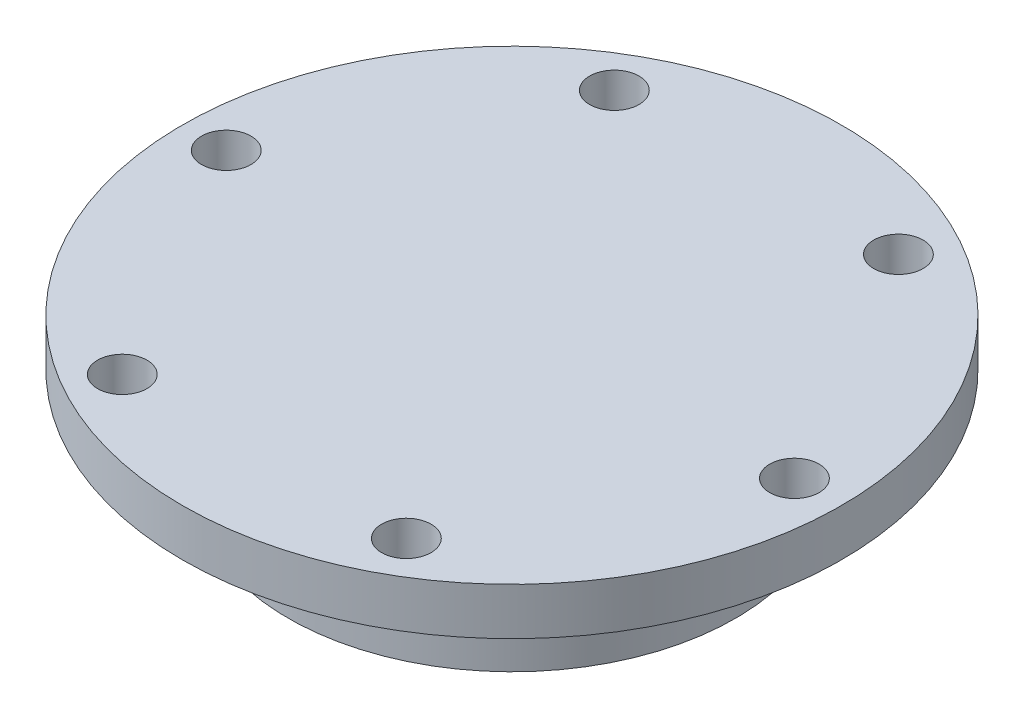
ISO-10303-21;
HEADER;
FILE_DESCRIPTION(('STEP AP214'),'2;1');
FILE_NAME('part.step','',(''),(''),'','','');
FILE_SCHEMA(('AUTOMOTIVE_DESIGN { 1 0 10303 214 1 1 1 1 }'));
ENDSEC;
DATA;
#1=APPLICATION_CONTEXT('core data for automotive mechanical design processes');
#2=APPLICATION_PROTOCOL_DEFINITION('international standard','automotive_design',2000,#1);
#3=PRODUCT_CONTEXT('',#1,'mechanical');
#4=PRODUCT('Part','Part','',(#3));
#5=PRODUCT_RELATED_PRODUCT_CATEGORY('part','',(#4));
#6=PRODUCT_DEFINITION_FORMATION('','',#4);
#7=PRODUCT_DEFINITION_CONTEXT('part definition',#1,'design');
#8=PRODUCT_DEFINITION('design','',#6,#7);
#9=PRODUCT_DEFINITION_SHAPE('','',#8);
#10=(LENGTH_UNIT() NAMED_UNIT(*) SI_UNIT(.MILLI.,.METRE.));
#11=(NAMED_UNIT(*) PLANE_ANGLE_UNIT() SI_UNIT($,.RADIAN.));
#12=(NAMED_UNIT(*) SI_UNIT($,.STERADIAN.) SOLID_ANGLE_UNIT());
#13=UNCERTAINTY_MEASURE_WITH_UNIT(LENGTH_MEASURE(1.E-05),#10,'distance_accuracy_value','');
#14=(GEOMETRIC_REPRESENTATION_CONTEXT(3) GLOBAL_UNCERTAINTY_ASSIGNED_CONTEXT((#13)) GLOBAL_UNIT_ASSIGNED_CONTEXT((#10,
#11,#12)) REPRESENTATION_CONTEXT('',''));
#15=CARTESIAN_POINT('',(0.,0.,0.));
#16=DIRECTION('',(0.,0.,1.));
#17=DIRECTION('',(1.,0.,0.));
#18=AXIS2_PLACEMENT_3D('',#15,#16,#17);
#19=CARTESIAN_POINT('',(0.,10.,0.));
#20=DIRECTION('',(0.,-1.,0.));
#21=DIRECTION('',(0.,0.,-1.));
#22=AXIS2_PLACEMENT_3D('',#19,#20,#21);
#23=CYLINDRICAL_SURFACE('',#22,70.);
#24=CARTESIAN_POINT('',(0.,10.,0.));
#25=DIRECTION('',(0.,1.,0.));
#26=DIRECTION('',(0.,0.,1.));
#27=AXIS2_PLACEMENT_3D('',#24,#25,#26);
#28=CIRCLE('',#27,70.);
#29=CARTESIAN_POINT('',(0.,10.,70.));
#30=VERTEX_POINT('',#29);
#31=EDGE_CURVE('E50',#30,#30,#28,.T.);
#32=ORIENTED_EDGE('',*,*,#31,.F.);
#33=EDGE_LOOP('',(#32));
#34=FACE_BOUND('',#33,.T.);
#35=CARTESIAN_POINT('',(0.,0.,0.));
#36=DIRECTION('',(0.,1.,0.));
#37=DIRECTION('',(0.,0.,1.));
#38=AXIS2_PLACEMENT_3D('',#35,#36,#37);
#39=CIRCLE('',#38,70.);
#40=CARTESIAN_POINT('',(0.,0.,70.));
#41=VERTEX_POINT('',#40);
#42=EDGE_CURVE('E55',#41,#41,#39,.T.);
#43=ORIENTED_EDGE('',*,*,#42,.T.);
#44=EDGE_LOOP('',(#43));
#45=FACE_BOUND('',#44,.T.);
#46=ADVANCED_FACE('F43',(#34,#45),#23,.T.);
#47=CARTESIAN_POINT('',(0.,10.,0.));
#48=DIRECTION('',(0.,1.,0.));
#49=DIRECTION('',(0.,0.,1.));
#50=AXIS2_PLACEMENT_3D('',#47,#48,#49);
#51=PLANE('',#50);
#52=CARTESIAN_POINT('',(29.8302954116914,10.,52.2554611962951));
#53=DIRECTION('',(0.,1.,0.));
#54=DIRECTION('',(0.,0.,1.));
#55=AXIS2_PLACEMENT_3D('',#52,#53,#54);
#56=CIRCLE('',#55,5.25);
#57=CARTESIAN_POINT('',(29.8302954116914,10.,57.5054611962951));
#58=VERTEX_POINT('',#57);
#59=EDGE_CURVE('E117',#58,#58,#56,.T.);
#60=ORIENTED_EDGE('',*,*,#59,.F.);
#61=EDGE_LOOP('',(#60));
#62=FACE_BOUND('',#61,.T.);
#63=CARTESIAN_POINT('',(-30.5091137649272,10.,52.2554611962958));
#64=DIRECTION('',(0.,1.,0.));
#65=DIRECTION('',(0.,0.,1.));
#66=AXIS2_PLACEMENT_3D('',#63,#64,#65);
#67=CIRCLE('',#66,5.24999999999999);
#68=CARTESIAN_POINT('',(-30.5091137649272,10.,57.5054611962958));
#69=VERTEX_POINT('',#68);
#70=EDGE_CURVE('E121',#69,#69,#67,.T.);
#71=ORIENTED_EDGE('',*,*,#70,.F.);
#72=EDGE_LOOP('',(#71));
#73=FACE_BOUND('',#72,.T.);
#74=CARTESIAN_POINT('',(-60.6788183532369,10.,0.));
#75=DIRECTION('',(0.,1.,0.));
#76=DIRECTION('',(0.,0.,1.));
#77=AXIS2_PLACEMENT_3D('',#74,#75,#76);
#78=CIRCLE('',#77,5.25);
#79=CARTESIAN_POINT('',(-60.6788183532369,10.,5.25000000000003));
#80=VERTEX_POINT('',#79);
#81=EDGE_CURVE('E125',#80,#80,#78,.T.);
#82=ORIENTED_EDGE('',*,*,#81,.F.);
#83=EDGE_LOOP('',(#82));
#84=FACE_BOUND('',#83,.T.);
#85=CARTESIAN_POINT('',(-30.509113764928,10.,-52.2554611962953));
#86=DIRECTION('',(0.,1.,0.));
#87=DIRECTION('',(0.,0.,1.));
#88=AXIS2_PLACEMENT_3D('',#85,#86,#87);
#89=CIRCLE('',#88,5.24999999999999);
#90=CARTESIAN_POINT('',(-30.509113764928,10.,-47.0054611962953));
#91=VERTEX_POINT('',#90);
#92=EDGE_CURVE('E77',#91,#91,#89,.T.);
#93=ORIENTED_EDGE('',*,*,#92,.F.);
#94=EDGE_LOOP('',(#93));
#95=FACE_BOUND('',#94,.T.);
#96=CARTESIAN_POINT('',(29.8302954116906,10.,-52.2554611962955));
#97=DIRECTION('',(0.,1.,0.));
#98=DIRECTION('',(0.,0.,1.));
#99=AXIS2_PLACEMENT_3D('',#96,#97,#98);
#100=CIRCLE('',#99,5.25);
#101=CARTESIAN_POINT('',(29.8302954116906,10.,-47.0054611962955));
#102=VERTEX_POINT('',#101);
#103=EDGE_CURVE('E65',#102,#102,#100,.T.);
#104=ORIENTED_EDGE('',*,*,#103,.F.);
#105=EDGE_LOOP('',(#104));
#106=FACE_BOUND('',#105,.T.);
#107=CARTESIAN_POINT('',(60.,10.,0.));
#108=DIRECTION('',(0.,1.,0.));
#109=DIRECTION('',(0.,0.,1.));
#110=AXIS2_PLACEMENT_3D('',#107,#108,#109);
#111=CIRCLE('',#110,5.24999999999999);
#112=CARTESIAN_POINT('',(60.,10.,5.24999999999999));
#113=VERTEX_POINT('',#112);
#114=EDGE_CURVE('E64',#113,#113,#111,.T.);
#115=ORIENTED_EDGE('',*,*,#114,.F.);
#116=EDGE_LOOP('',(#115));
#117=FACE_BOUND('',#116,.T.);
#118=ORIENTED_EDGE('',*,*,#31,.T.);
#119=EDGE_LOOP('',(#118));
#120=FACE_BOUND('',#119,.T.);
#121=ADVANCED_FACE('F98',(#62,#73,#84,#95,#106,#117,#120),#51,.T.);
#122=CARTESIAN_POINT('',(0.,0.,0.));
#123=DIRECTION('',(0.,1.,0.));
#124=DIRECTION('',(0.,0.,1.));
#125=AXIS2_PLACEMENT_3D('',#122,#123,#124);
#126=PLANE('',#125);
#127=CARTESIAN_POINT('',(29.8302954116914,0.,52.2554611962951));
#128=DIRECTION('',(0.,1.,0.));
#129=DIRECTION('',(0.,0.,1.));
#130=AXIS2_PLACEMENT_3D('',#127,#128,#129);
#131=CIRCLE('',#130,5.24999999999999);
#132=CARTESIAN_POINT('',(29.8302954116914,0.,57.5054611962951));
#133=VERTEX_POINT('',#132);
#134=EDGE_CURVE('E46',#133,#133,#131,.T.);
#135=ORIENTED_EDGE('',*,*,#134,.T.);
#136=EDGE_LOOP('',(#135));
#137=FACE_BOUND('',#136,.T.);
#138=CARTESIAN_POINT('',(-30.5091137649272,0.,52.2554611962958));
#139=DIRECTION('',(0.,1.,0.));
#140=DIRECTION('',(0.,0.,1.));
#141=AXIS2_PLACEMENT_3D('',#138,#139,#140);
#142=CIRCLE('',#141,5.24999999999999);
#143=CARTESIAN_POINT('',(-30.5091137649272,0.,57.5054611962958));
#144=VERTEX_POINT('',#143);
#145=EDGE_CURVE('E161',#144,#144,#142,.T.);
#146=ORIENTED_EDGE('',*,*,#145,.T.);
#147=EDGE_LOOP('',(#146));
#148=FACE_BOUND('',#147,.T.);
#149=CARTESIAN_POINT('',(-60.6788183532369,0.,0.));
#150=DIRECTION('',(0.,1.,0.));
#151=DIRECTION('',(0.,0.,1.));
#152=AXIS2_PLACEMENT_3D('',#149,#150,#151);
#153=CIRCLE('',#152,5.24999999999999);
#154=CARTESIAN_POINT('',(-60.6788183532369,0.,5.25000000000002));
#155=VERTEX_POINT('',#154);
#156=EDGE_CURVE('E168',#155,#155,#153,.T.);
#157=ORIENTED_EDGE('',*,*,#156,.T.);
#158=EDGE_LOOP('',(#157));
#159=FACE_BOUND('',#158,.T.);
#160=CARTESIAN_POINT('',(-30.509113764928,0.,-52.2554611962953));
#161=DIRECTION('',(0.,1.,0.));
#162=DIRECTION('',(0.,0.,1.));
#163=AXIS2_PLACEMENT_3D('',#160,#161,#162);
#164=CIRCLE('',#163,5.24999999999999);
#165=CARTESIAN_POINT('',(-30.509113764928,0.,-47.0054611962953));
#166=VERTEX_POINT('',#165);
#167=EDGE_CURVE('E72',#166,#166,#164,.T.);
#168=ORIENTED_EDGE('',*,*,#167,.T.);
#169=EDGE_LOOP('',(#168));
#170=FACE_BOUND('',#169,.T.);
#171=CARTESIAN_POINT('',(29.8302954116906,0.,-52.2554611962955));
#172=DIRECTION('',(0.,1.,0.));
#173=DIRECTION('',(0.,0.,1.));
#174=AXIS2_PLACEMENT_3D('',#171,#172,#173);
#175=CIRCLE('',#174,5.24999999999999);
#176=CARTESIAN_POINT('',(29.8302954116906,0.,-47.0054611962955));
#177=VERTEX_POINT('',#176);
#178=EDGE_CURVE('E62',#177,#177,#175,.T.);
#179=ORIENTED_EDGE('',*,*,#178,.T.);
#180=EDGE_LOOP('',(#179));
#181=FACE_BOUND('',#180,.T.);
#182=CARTESIAN_POINT('',(60.,0.,0.));
#183=DIRECTION('',(0.,1.,0.));
#184=DIRECTION('',(0.,0.,1.));
#185=AXIS2_PLACEMENT_3D('',#182,#183,#184);
#186=CIRCLE('',#185,5.24999999999999);
#187=CARTESIAN_POINT('',(60.,0.,5.24999999999999));
#188=VERTEX_POINT('',#187);
#189=EDGE_CURVE('E69',#188,#188,#186,.T.);
#190=ORIENTED_EDGE('',*,*,#189,.T.);
#191=EDGE_LOOP('',(#190));
#192=FACE_BOUND('',#191,.T.);
#193=CARTESIAN_POINT('',(0.,0.,0.));
#194=DIRECTION('',(0.,-1.,0.));
#195=DIRECTION('',(0.,0.,-1.));
#196=AXIS2_PLACEMENT_3D('',#193,#194,#195);
#197=CIRCLE('',#196,47.5);
#198=CARTESIAN_POINT('',(0.,0.,-47.5));
#199=VERTEX_POINT('',#198);
#200=EDGE_CURVE('E12',#199,#199,#197,.T.);
#201=ORIENTED_EDGE('',*,*,#200,.F.);
#202=EDGE_LOOP('',(#201));
#203=FACE_BOUND('',#202,.T.);
#204=ORIENTED_EDGE('',*,*,#42,.F.);
#205=EDGE_LOOP('',(#204));
#206=FACE_BOUND('',#205,.T.);
#207=ADVANCED_FACE('F90',(#137,#148,#159,#170,#181,#192,#203,#206),#126,.F.);
#208=CARTESIAN_POINT('',(0.,-22.,0.));
#209=DIRECTION('',(0.,1.,0.));
#210=DIRECTION('',(0.,0.,1.));
#211=AXIS2_PLACEMENT_3D('',#208,#209,#210);
#212=CYLINDRICAL_SURFACE('',#211,47.5);
#213=CARTESIAN_POINT('',(0.,-22.,0.));
#214=DIRECTION('',(0.,-1.,0.));
#215=DIRECTION('',(0.,0.,-1.));
#216=AXIS2_PLACEMENT_3D('',#213,#214,#215);
#217=CIRCLE('',#216,47.5);
#218=CARTESIAN_POINT('',(0.,-22.,-47.5));
#219=VERTEX_POINT('',#218);
#220=EDGE_CURVE('E58',#219,#219,#217,.T.);
#221=ORIENTED_EDGE('',*,*,#220,.F.);
#222=EDGE_LOOP('',(#221));
#223=FACE_BOUND('',#222,.T.);
#224=ORIENTED_EDGE('',*,*,#200,.T.);
#225=EDGE_LOOP('',(#224));
#226=FACE_BOUND('',#225,.T.);
#227=ADVANCED_FACE('F88',(#223,#226),#212,.T.);
#228=CARTESIAN_POINT('',(0.,-22.,0.));
#229=DIRECTION('',(0.,-1.,0.));
#230=DIRECTION('',(0.,0.,-1.));
#231=AXIS2_PLACEMENT_3D('',#228,#229,#230);
#232=PLANE('',#231);
#233=ORIENTED_EDGE('',*,*,#220,.T.);
#234=EDGE_LOOP('',(#233));
#235=FACE_BOUND('',#234,.T.);
#236=ADVANCED_FACE('F86',(#235),#232,.T.);
#237=CARTESIAN_POINT('',(60.,10.,0.));
#238=DIRECTION('',(0.,1.,0.));
#239=DIRECTION('',(0.,0.,1.));
#240=AXIS2_PLACEMENT_3D('',#237,#238,#239);
#241=CYLINDRICAL_SURFACE('',#240,5.24999999999999);
#242=ORIENTED_EDGE('',*,*,#114,.T.);
#243=EDGE_LOOP('',(#242));
#244=FACE_BOUND('',#243,.T.);
#245=ORIENTED_EDGE('',*,*,#189,.F.);
#246=EDGE_LOOP('',(#245));
#247=FACE_BOUND('',#246,.T.);
#248=ADVANCED_FACE('F96',(#244,#247),#241,.F.);
#249=CARTESIAN_POINT('',(29.8302954116906,10.,-52.2554611962955));
#250=DIRECTION('',(0.,1.,0.));
#251=DIRECTION('',(0.,0.,1.));
#252=AXIS2_PLACEMENT_3D('',#249,#250,#251);
#253=CYLINDRICAL_SURFACE('',#252,5.24999999999999);
#254=ORIENTED_EDGE('',*,*,#103,.T.);
#255=EDGE_LOOP('',(#254));
#256=FACE_BOUND('',#255,.T.);
#257=ORIENTED_EDGE('',*,*,#178,.F.);
#258=EDGE_LOOP('',(#257));
#259=FACE_BOUND('',#258,.T.);
#260=ADVANCED_FACE('F134',(#256,#259),#253,.F.);
#261=CARTESIAN_POINT('',(-30.509113764928,10.,-52.2554611962953));
#262=DIRECTION('',(0.,1.,0.));
#263=DIRECTION('',(0.,0.,1.));
#264=AXIS2_PLACEMENT_3D('',#261,#262,#263);
#265=CYLINDRICAL_SURFACE('',#264,5.24999999999999);
#266=ORIENTED_EDGE('',*,*,#92,.T.);
#267=EDGE_LOOP('',(#266));
#268=FACE_BOUND('',#267,.T.);
#269=ORIENTED_EDGE('',*,*,#167,.F.);
#270=EDGE_LOOP('',(#269));
#271=FACE_BOUND('',#270,.T.);
#272=ADVANCED_FACE('F139',(#268,#271),#265,.F.);
#273=CARTESIAN_POINT('',(-60.6788183532369,10.,0.));
#274=DIRECTION('',(0.,1.,0.));
#275=DIRECTION('',(0.,0.,1.));
#276=AXIS2_PLACEMENT_3D('',#273,#274,#275);
#277=CYLINDRICAL_SURFACE('',#276,5.24999999999999);
#278=ORIENTED_EDGE('',*,*,#81,.T.);
#279=EDGE_LOOP('',(#278));
#280=FACE_BOUND('',#279,.T.);
#281=ORIENTED_EDGE('',*,*,#156,.F.);
#282=EDGE_LOOP('',(#281));
#283=FACE_BOUND('',#282,.T.);
#284=ADVANCED_FACE('F144',(#280,#283),#277,.F.);
#285=CARTESIAN_POINT('',(-30.5091137649272,10.,52.2554611962958));
#286=DIRECTION('',(0.,1.,0.));
#287=DIRECTION('',(0.,0.,1.));
#288=AXIS2_PLACEMENT_3D('',#285,#286,#287);
#289=CYLINDRICAL_SURFACE('',#288,5.24999999999999);
#290=ORIENTED_EDGE('',*,*,#70,.T.);
#291=EDGE_LOOP('',(#290));
#292=FACE_BOUND('',#291,.T.);
#293=ORIENTED_EDGE('',*,*,#145,.F.);
#294=EDGE_LOOP('',(#293));
#295=FACE_BOUND('',#294,.T.);
#296=ADVANCED_FACE('F148',(#292,#295),#289,.F.);
#297=CARTESIAN_POINT('',(29.8302954116914,10.,52.2554611962951));
#298=DIRECTION('',(0.,1.,0.));
#299=DIRECTION('',(0.,0.,1.));
#300=AXIS2_PLACEMENT_3D('',#297,#298,#299);
#301=CYLINDRICAL_SURFACE('',#300,5.24999999999999);
#302=ORIENTED_EDGE('',*,*,#59,.T.);
#303=EDGE_LOOP('',(#302));
#304=FACE_BOUND('',#303,.T.);
#305=ORIENTED_EDGE('',*,*,#134,.F.);
#306=EDGE_LOOP('',(#305));
#307=FACE_BOUND('',#306,.T.);
#308=ADVANCED_FACE('F152',(#304,#307),#301,.F.);
#309=CLOSED_SHELL('',(#46,#121,#207,#227,#236,#248,#260,#272,#284,#296,#308));
#310=MANIFOLD_SOLID_BREP('B2',#309);
#311=ADVANCED_BREP_SHAPE_REPRESENTATION('',(#18,#310),#14);
#312=SHAPE_DEFINITION_REPRESENTATION(#9,#311);
ENDSEC;
END-ISO-10303-21;
